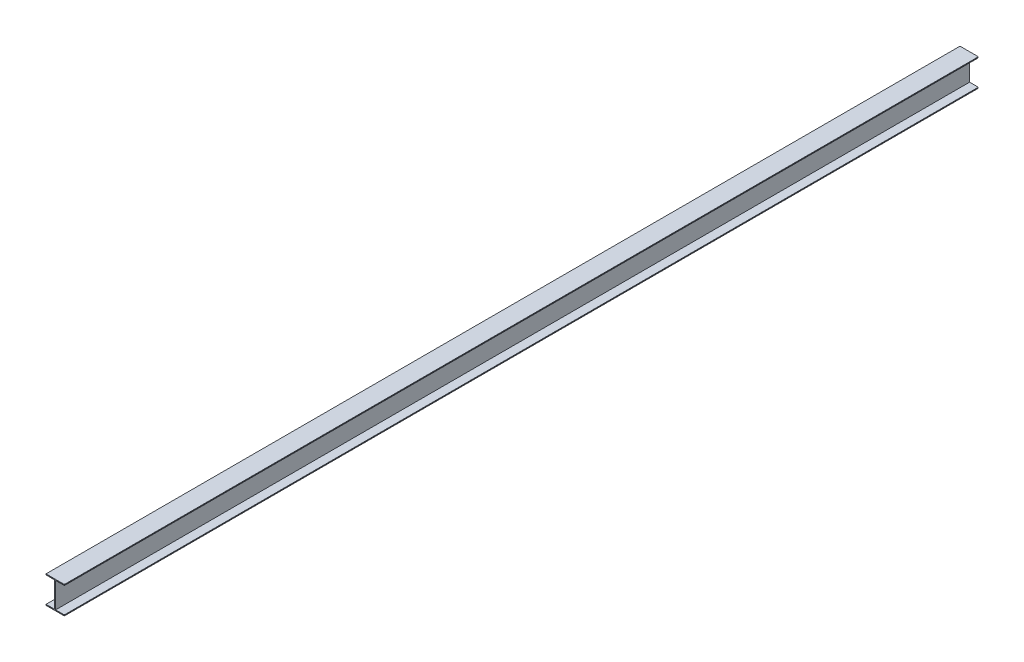
ISO-10303-21;
HEADER;
FILE_DESCRIPTION(('STEP AP214'),'2;1');
FILE_NAME('part.step','',(''),(''),'','','');
FILE_SCHEMA(('AUTOMOTIVE_DESIGN { 1 0 10303 214 1 1 1 1 }'));
ENDSEC;
DATA;
#1=APPLICATION_CONTEXT('core data for automotive mechanical design processes');
#2=APPLICATION_PROTOCOL_DEFINITION('international standard','automotive_design',2000,#1);
#3=PRODUCT_CONTEXT('',#1,'mechanical');
#4=PRODUCT('Part','Part','',(#3));
#5=PRODUCT_RELATED_PRODUCT_CATEGORY('part','',(#4));
#6=PRODUCT_DEFINITION_FORMATION('','',#4);
#7=PRODUCT_DEFINITION_CONTEXT('part definition',#1,'design');
#8=PRODUCT_DEFINITION('design','',#6,#7);
#9=PRODUCT_DEFINITION_SHAPE('','',#8);
#10=(LENGTH_UNIT() NAMED_UNIT(*) SI_UNIT(.MILLI.,.METRE.));
#11=(NAMED_UNIT(*) PLANE_ANGLE_UNIT() SI_UNIT($,.RADIAN.));
#12=(NAMED_UNIT(*) SI_UNIT($,.STERADIAN.) SOLID_ANGLE_UNIT());
#13=UNCERTAINTY_MEASURE_WITH_UNIT(LENGTH_MEASURE(1.E-05),#10,'distance_accuracy_value','');
#14=(GEOMETRIC_REPRESENTATION_CONTEXT(3) GLOBAL_UNCERTAINTY_ASSIGNED_CONTEXT((#13)) GLOBAL_UNIT_ASSIGNED_CONTEXT((#10,
#11,#12)) REPRESENTATION_CONTEXT('',''));
#15=CARTESIAN_POINT('',(0.,0.,0.));
#16=DIRECTION('',(0.,0.,1.));
#17=DIRECTION('',(1.,0.,0.));
#18=AXIS2_PLACEMENT_3D('',#15,#16,#17);
#19=CARTESIAN_POINT('',(101.6,-153.162240532958,5062.));
#20=DIRECTION('',(0.,1.,0.));
#21=DIRECTION('',(0.,0.,1.));
#22=AXIS2_PLACEMENT_3D('',#19,#20,#21);
#23=PLANE('',#22);
#24=DIRECTION('',(-1.,0.,0.));
#25=VECTOR('',#24,1.);
#26=CARTESIAN_POINT('',(101.6,-153.162240532958,2683.4));
#27=LINE('',#26,#25);
#28=CARTESIAN_POINT('',(98.425,-153.162240532958,2683.4));
#29=VERTEX_POINT('',#28);
#30=CARTESIAN_POINT('',(3.175,-153.162240532958,2683.4));
#31=VERTEX_POINT('',#30);
#32=EDGE_CURVE('E287',#29,#31,#27,.T.);
#33=ORIENTED_EDGE('',*,*,#32,.F.);
#34=DIRECTION('',(0.,0.,-1.));
#35=VECTOR('',#34,1.);
#36=CARTESIAN_POINT('',(98.425,-153.162240532958,5062.));
#37=LINE('',#36,#35);
#38=CARTESIAN_POINT('',(98.425,-153.162240532958,5058.825));
#39=VERTEX_POINT('',#38);
#40=EDGE_CURVE('E355',#29,#39,#37,.F.);
#41=ORIENTED_EDGE('',*,*,#40,.T.);
#42=DIRECTION('',(1.,0.,0.));
#43=VECTOR('',#42,1.);
#44=CARTESIAN_POINT('',(101.6,-153.162240532958,5058.825));
#45=LINE('',#44,#43);
#46=CARTESIAN_POINT('',(3.175,-153.162240532958,5058.825));
#47=VERTEX_POINT('',#46);
#48=EDGE_CURVE('E351',#39,#47,#45,.F.);
#49=ORIENTED_EDGE('',*,*,#48,.T.);
#50=DIRECTION('',(0.,0.,-1.));
#51=VECTOR('',#50,1.);
#52=CARTESIAN_POINT('',(3.175,-153.162240532958,5062.));
#53=LINE('',#52,#51);
#54=EDGE_CURVE('E353',#47,#31,#53,.T.);
#55=ORIENTED_EDGE('',*,*,#54,.T.);
#56=EDGE_LOOP('',(#33,#41,#49,#55));
#57=FACE_BOUND('',#56,.T.);
#58=ADVANCED_FACE('F38',(#57),#23,.F.);
#59=DIRECTION('',(1.,0.,0.));
#60=VECTOR('',#59,1.);
#61=CARTESIAN_POINT('',(101.6,-153.162240532958,2378.6));
#62=LINE('',#61,#60);
#63=CARTESIAN_POINT('',(3.175,-153.162240532958,2378.6));
#64=VERTEX_POINT('',#63);
#65=CARTESIAN_POINT('',(98.425,-153.162240532958,2378.6));
#66=VERTEX_POINT('',#65);
#67=EDGE_CURVE('E283',#64,#66,#62,.T.);
#68=ORIENTED_EDGE('',*,*,#67,.F.);
#69=DIRECTION('',(0.,0.,-1.));
#70=VECTOR('',#69,1.);
#71=CARTESIAN_POINT('',(3.175,-153.162240532958,5062.));
#72=LINE('',#71,#70);
#73=CARTESIAN_POINT('',(3.175,-153.162240532958,3.17499999999971));
#74=VERTEX_POINT('',#73);
#75=EDGE_CURVE('E323',#64,#74,#72,.T.);
#76=ORIENTED_EDGE('',*,*,#75,.T.);
#77=DIRECTION('',(1.,0.,0.));
#78=VECTOR('',#77,1.);
#79=CARTESIAN_POINT('',(98.425,-153.162240532958,3.17499999999971));
#80=LINE('',#79,#78);
#81=CARTESIAN_POINT('',(98.425,-153.162240532958,3.17499999999971));
#82=VERTEX_POINT('',#81);
#83=EDGE_CURVE('E321',#74,#82,#80,.T.);
#84=ORIENTED_EDGE('',*,*,#83,.T.);
#85=DIRECTION('',(0.,0.,-1.));
#86=VECTOR('',#85,1.);
#87=CARTESIAN_POINT('',(98.425,-153.162240532958,5062.));
#88=LINE('',#87,#86);
#89=EDGE_CURVE('E319',#82,#66,#88,.F.);
#90=ORIENTED_EDGE('',*,*,#89,.T.);
#91=EDGE_LOOP('',(#68,#76,#84,#90));
#92=FACE_BOUND('',#91,.T.);
#93=ADVANCED_FACE('F571',(#92),#23,.F.);
#94=CARTESIAN_POINT('',(0.,-7.11224053295814,5062.));
#95=DIRECTION('',(1.,0.,0.));
#96=DIRECTION('',(0.,0.,-1.));
#97=AXIS2_PLACEMENT_3D('',#94,#95,#96);
#98=PLANE('',#97);
#99=DIRECTION('',(0.,-1.,0.));
#100=VECTOR('',#99,1.);
#101=CARTESIAN_POINT('',(0.,-7.11224053295814,0.));
#102=LINE('',#101,#100);
#103=CARTESIAN_POINT('',(0.,-0.000240532958142959,0.));
#104=VERTEX_POINT('',#103);
#105=CARTESIAN_POINT('',(0.,-3.93724053295814,0.));
#106=VERTEX_POINT('',#105);
#107=EDGE_CURVE('E250',#104,#106,#102,.T.);
#108=ORIENTED_EDGE('',*,*,#107,.T.);
#109=DIRECTION('',(0.,0.,-1.));
#110=VECTOR('',#109,1.);
#111=CARTESIAN_POINT('',(0.,-3.93724053295814,5062.));
#112=LINE('',#111,#110);
#113=CARTESIAN_POINT('',(0.,-3.93724053295814,5062.));
#114=VERTEX_POINT('',#113);
#115=EDGE_CURVE('E417',#106,#114,#112,.F.);
#116=ORIENTED_EDGE('',*,*,#115,.T.);
#117=DIRECTION('',(0.,-1.,0.));
#118=VECTOR('',#117,1.);
#119=CARTESIAN_POINT('',(0.,-7.11224053295814,5062.));
#120=LINE('',#119,#118);
#121=CARTESIAN_POINT('',(0.,-0.000240532958142959,5062.));
#122=VERTEX_POINT('',#121);
#123=EDGE_CURVE('E224',#122,#114,#120,.T.);
#124=ORIENTED_EDGE('',*,*,#123,.F.);
#125=DIRECTION('',(0.,0.,-1.));
#126=VECTOR('',#125,1.);
#127=CARTESIAN_POINT('',(0.,-0.000240532958142959,5062.));
#128=LINE('',#127,#126);
#129=EDGE_CURVE('E249',#122,#104,#128,.T.);
#130=ORIENTED_EDGE('',*,*,#129,.T.);
#131=EDGE_LOOP('',(#108,#116,#124,#130));
#132=FACE_BOUND('',#131,.T.);
#133=ADVANCED_FACE('F459',(#132),#98,.F.);
#134=CARTESIAN_POINT('',(47.5660357142857,-7.11224053295814,5062.));
#135=DIRECTION('',(0.,1.,0.));
#136=DIRECTION('',(-1.,0.,0.));
#137=AXIS2_PLACEMENT_3D('',#134,#135,#136);
#138=PLANE('',#137);
#139=DIRECTION('',(0.,0.,-1.));
#140=VECTOR('',#139,1.);
#141=CARTESIAN_POINT('',(3.17499999999997,-7.11224053295814,5062.));
#142=LINE('',#141,#140);
#143=CARTESIAN_POINT('',(3.17499999999997,-7.11224053295814,5058.825));
#144=VERTEX_POINT('',#143);
#145=CARTESIAN_POINT('',(3.17499999999997,-7.11224053295814,3.17499999999971));
#146=VERTEX_POINT('',#145);
#147=EDGE_CURVE('E412',#144,#146,#142,.T.);
#148=ORIENTED_EDGE('',*,*,#147,.T.);
#149=DIRECTION('',(1.,0.,0.));
#150=VECTOR('',#149,1.);
#151=CARTESIAN_POINT('',(47.5660357142857,-7.11224053295814,3.17499999999971));
#152=LINE('',#151,#150);
#153=CARTESIAN_POINT('',(47.5660357142857,-7.11224053295814,3.17499999999971));
#154=VERTEX_POINT('',#153);
#155=EDGE_CURVE('E414',#146,#154,#152,.T.);
#156=ORIENTED_EDGE('',*,*,#155,.T.);
#157=DIRECTION('',(0.,0.,-1.));
#158=VECTOR('',#157,1.);
#159=CARTESIAN_POINT('',(47.5660357142857,-7.11224053295814,5062.));
#160=LINE('',#159,#158);
#161=CARTESIAN_POINT('',(47.5660357142857,-7.11224053295814,5058.825));
#162=VERTEX_POINT('',#161);
#163=EDGE_CURVE('E233',#162,#154,#160,.T.);
#164=ORIENTED_EDGE('',*,*,#163,.F.);
#165=DIRECTION('',(1.,0.,0.));
#166=VECTOR('',#165,1.);
#167=CARTESIAN_POINT('',(47.5660357142857,-7.11224053295814,5058.825));
#168=LINE('',#167,#166);
#169=EDGE_CURVE('E410',#162,#144,#168,.F.);
#170=ORIENTED_EDGE('',*,*,#169,.T.);
#171=EDGE_LOOP('',(#148,#156,#164,#170));
#172=FACE_BOUND('',#171,.T.);
#173=ADVANCED_FACE('F452',(#172),#138,.F.);
#174=CARTESIAN_POINT('',(47.5660357142857,-146.050240532958,5062.));
#175=DIRECTION('',(1.,0.,0.));
#176=DIRECTION('',(0.,0.,-1.));
#177=AXIS2_PLACEMENT_3D('',#174,#175,#176);
#178=PLANE('',#177);
#179=DIRECTION('',(0.,-1.,0.));
#180=VECTOR('',#179,1.);
#181=CARTESIAN_POINT('',(47.5660357142857,-146.050240532958,0.));
#182=LINE('',#181,#180);
#183=CARTESIAN_POINT('',(47.5660357142857,-3.93724053295814,0.));
#184=VERTEX_POINT('',#183);
#185=CARTESIAN_POINT('',(47.5660357142857,-146.050240532958,0.));
#186=VERTEX_POINT('',#185);
#187=EDGE_CURVE('E230',#184,#186,#182,.T.);
#188=ORIENTED_EDGE('',*,*,#187,.T.);
#189=DIRECTION('',(0.,0.,-1.));
#190=VECTOR('',#189,1.);
#191=CARTESIAN_POINT('',(47.5660357142857,-146.050240532958,5062.));
#192=LINE('',#191,#190);
#193=CARTESIAN_POINT('',(47.5660357142857,-146.050240532958,5062.));
#194=VERTEX_POINT('',#193);
#195=EDGE_CURVE('E227',#194,#186,#192,.T.);
#196=ORIENTED_EDGE('',*,*,#195,.F.);
#197=DIRECTION('',(0.,-1.,0.));
#198=VECTOR('',#197,1.);
#199=CARTESIAN_POINT('',(47.5660357142857,-146.050240532958,5062.));
#200=LINE('',#199,#198);
#201=CARTESIAN_POINT('',(47.5660357142857,-3.93724053295813,5062.));
#202=VERTEX_POINT('',#201);
#203=EDGE_CURVE('E62',#202,#194,#200,.T.);
#204=ORIENTED_EDGE('',*,*,#203,.F.);
#205=CARTESIAN_POINT('',(47.5660357142857,-3.93724053295814,5058.825));
#206=DIRECTION('',(1.,0.,0.));
#207=DIRECTION('',(0.,0.,-1.));
#208=AXIS2_PLACEMENT_3D('',#205,#206,#207);
#209=CIRCLE('',#208,3.175);
#210=EDGE_CURVE('E11',#202,#162,#209,.T.);
#211=ORIENTED_EDGE('',*,*,#210,.T.);
#212=ORIENTED_EDGE('',*,*,#163,.T.);
#213=CARTESIAN_POINT('',(47.5660357142857,-3.93724053295814,3.17499999999971));
#214=DIRECTION('',(1.,0.,0.));
#215=DIRECTION('',(0.,0.,-1.));
#216=AXIS2_PLACEMENT_3D('',#213,#214,#215);
#217=CIRCLE('',#216,3.175);
#218=EDGE_CURVE('E424',#154,#184,#217,.T.);
#219=ORIENTED_EDGE('',*,*,#218,.T.);
#220=EDGE_LOOP('',(#188,#196,#204,#211,#212,#219));
#221=FACE_BOUND('',#220,.T.);
#222=ADVANCED_FACE('F228',(#221),#178,.F.);
#223=CARTESIAN_POINT('',(0.,-146.050240532958,5062.));
#224=DIRECTION('',(0.,-1.,0.));
#225=DIRECTION('',(1.,0.,0.));
#226=AXIS2_PLACEMENT_3D('',#223,#224,#225);
#227=PLANE('',#226);
#228=DIRECTION('',(-1.,0.,0.));
#229=VECTOR('',#228,1.);
#230=CARTESIAN_POINT('',(0.,-146.050240532958,0.));
#231=LINE('',#230,#229);
#232=CARTESIAN_POINT('',(0.,-146.050240532958,0.));
#233=VERTEX_POINT('',#232);
#234=EDGE_CURVE('E255',#186,#233,#231,.T.);
#235=ORIENTED_EDGE('',*,*,#234,.T.);
#236=DIRECTION('',(0.,0.,-1.));
#237=VECTOR('',#236,1.);
#238=CARTESIAN_POINT('',(0.,-146.050240532958,5062.));
#239=LINE('',#238,#237);
#240=CARTESIAN_POINT('',(0.,-146.050240532958,5062.));
#241=VERTEX_POINT('',#240);
#242=EDGE_CURVE('E234',#241,#233,#239,.T.);
#243=ORIENTED_EDGE('',*,*,#242,.F.);
#244=DIRECTION('',(-1.,0.,0.));
#245=VECTOR('',#244,1.);
#246=CARTESIAN_POINT('',(0.,-146.050240532958,5062.));
#247=LINE('',#246,#245);
#248=EDGE_CURVE('E218',#194,#241,#247,.T.);
#249=ORIENTED_EDGE('',*,*,#248,.F.);
#250=ORIENTED_EDGE('',*,*,#195,.T.);
#251=EDGE_LOOP('',(#235,#243,#249,#250));
#252=FACE_BOUND('',#251,.T.);
#253=ADVANCED_FACE('F236',(#252),#227,.F.);
#254=CARTESIAN_POINT('',(0.,-153.162240532958,5062.));
#255=DIRECTION('',(1.,0.,0.));
#256=DIRECTION('',(0.,0.,-1.));
#257=AXIS2_PLACEMENT_3D('',#254,#255,#256);
#258=PLANE('',#257);
#259=DIRECTION('',(0.,-1.,0.));
#260=VECTOR('',#259,1.);
#261=CARTESIAN_POINT('',(0.,-153.162240532958,0.));
#262=LINE('',#261,#260);
#263=CARTESIAN_POINT('',(0.,-149.987240532958,0.));
#264=VERTEX_POINT('',#263);
#265=EDGE_CURVE('E257',#233,#264,#262,.T.);
#266=ORIENTED_EDGE('',*,*,#265,.T.);
#267=DIRECTION('',(0.,0.,-1.));
#268=VECTOR('',#267,1.);
#269=CARTESIAN_POINT('',(0.,-149.987240532958,5062.));
#270=LINE('',#269,#268);
#271=CARTESIAN_POINT('',(0.,-149.987240532958,2378.6));
#272=VERTEX_POINT('',#271);
#273=EDGE_CURVE('E330',#264,#272,#270,.F.);
#274=ORIENTED_EDGE('',*,*,#273,.T.);
#275=DIRECTION('',(0.,0.,-1.));
#276=VECTOR('',#275,1.);
#277=CARTESIAN_POINT('',(0.,-149.987240532958,5062.));
#278=LINE('',#277,#276);
#279=CARTESIAN_POINT('',(0.,-149.987240532958,2683.4));
#280=VERTEX_POINT('',#279);
#281=EDGE_CURVE('E328',#272,#280,#278,.F.);
#282=ORIENTED_EDGE('',*,*,#281,.T.);
#283=DIRECTION('',(0.,0.,-1.));
#284=VECTOR('',#283,1.);
#285=CARTESIAN_POINT('',(0.,-149.987240532958,5062.));
#286=LINE('',#285,#284);
#287=CARTESIAN_POINT('',(0.,-149.987240532958,5062.));
#288=VERTEX_POINT('',#287);
#289=EDGE_CURVE('E326',#280,#288,#286,.F.);
#290=ORIENTED_EDGE('',*,*,#289,.T.);
#291=DIRECTION('',(0.,-1.,0.));
#292=VECTOR('',#291,1.);
#293=CARTESIAN_POINT('',(0.,-153.162240532958,5062.));
#294=LINE('',#293,#292);
#295=EDGE_CURVE('E239',#241,#288,#294,.T.);
#296=ORIENTED_EDGE('',*,*,#295,.F.);
#297=ORIENTED_EDGE('',*,*,#242,.T.);
#298=EDGE_LOOP('',(#266,#274,#282,#290,#296,#297));
#299=FACE_BOUND('',#298,.T.);
#300=ADVANCED_FACE('F514',(#299),#258,.F.);
#301=ORIENTED_EDGE('',*,*,#32,.T.);
#302=DIRECTION('',(0.,0.,-1.));
#303=VECTOR('',#302,1.);
#304=CARTESIAN_POINT('',(3.175,-153.162240532958,5062.));
#305=LINE('',#304,#303);
#306=EDGE_CURVE('E337',#31,#64,#305,.T.);
#307=ORIENTED_EDGE('',*,*,#306,.T.);
#308=ORIENTED_EDGE('',*,*,#67,.T.);
#309=DIRECTION('',(0.,0.,-1.));
#310=VECTOR('',#309,1.);
#311=CARTESIAN_POINT('',(98.425,-153.162240532958,5062.));
#312=LINE('',#311,#310);
#313=CARTESIAN_POINT('',(98.425,-153.162240532958,2531.));
#314=VERTEX_POINT('',#313);
#315=EDGE_CURVE('E335',#66,#314,#312,.F.);
#316=ORIENTED_EDGE('',*,*,#315,.T.);
#317=DIRECTION('',(0.,0.,-1.));
#318=VECTOR('',#317,1.);
#319=CARTESIAN_POINT('',(98.425,-153.162240532958,5062.));
#320=LINE('',#319,#318);
#321=EDGE_CURVE('E333',#314,#29,#320,.F.);
#322=ORIENTED_EDGE('',*,*,#321,.T.);
#323=EDGE_LOOP('',(#301,#307,#308,#316,#322));
#324=FACE_BOUND('',#323,.T.);
#325=ADVANCED_FACE('F532',(#324),#23,.F.);
#326=CARTESIAN_POINT('',(101.6,-146.050240532958,5062.));
#327=DIRECTION('',(-1.,0.,0.));
#328=DIRECTION('',(0.,0.,1.));
#329=AXIS2_PLACEMENT_3D('',#326,#327,#328);
#330=PLANE('',#329);
#331=DIRECTION('',(0.,0.,-1.));
#332=VECTOR('',#331,1.);
#333=CARTESIAN_POINT('',(101.6,-149.987240532958,5062.));
#334=LINE('',#333,#332);
#335=CARTESIAN_POINT('',(101.6,-149.987240532958,2531.));
#336=VERTEX_POINT('',#335);
#337=CARTESIAN_POINT('',(101.6,-149.987240532958,2378.6));
#338=VERTEX_POINT('',#337);
#339=EDGE_CURVE('E347',#336,#338,#334,.T.);
#340=ORIENTED_EDGE('',*,*,#339,.T.);
#341=DIRECTION('',(0.,0.,-1.));
#342=VECTOR('',#341,1.);
#343=CARTESIAN_POINT('',(101.6,-149.987240532958,5062.));
#344=LINE('',#343,#342);
#345=CARTESIAN_POINT('',(101.6,-149.987240532958,3.17499999999971));
#346=VERTEX_POINT('',#345);
#347=EDGE_CURVE('E349',#338,#346,#344,.T.);
#348=ORIENTED_EDGE('',*,*,#347,.T.);
#349=DIRECTION('',(0.,1.,0.));
#350=VECTOR('',#349,1.);
#351=CARTESIAN_POINT('',(101.6,-146.050240532958,3.17499999999971));
#352=LINE('',#351,#350);
#353=CARTESIAN_POINT('',(101.6,-146.050240532958,3.17499999999971));
#354=VERTEX_POINT('',#353);
#355=EDGE_CURVE('E308',#346,#354,#352,.T.);
#356=ORIENTED_EDGE('',*,*,#355,.T.);
#357=DIRECTION('',(0.,0.,-1.));
#358=VECTOR('',#357,1.);
#359=CARTESIAN_POINT('',(101.6,-146.050240532958,5062.));
#360=LINE('',#359,#358);
#361=CARTESIAN_POINT('',(101.6,-146.050240532958,5058.825));
#362=VERTEX_POINT('',#361);
#363=EDGE_CURVE('E277',#362,#354,#360,.T.);
#364=ORIENTED_EDGE('',*,*,#363,.F.);
#365=DIRECTION('',(0.,1.,0.));
#366=VECTOR('',#365,1.);
#367=CARTESIAN_POINT('',(101.6,-146.050240532958,5058.825));
#368=LINE('',#367,#366);
#369=CARTESIAN_POINT('',(101.6,-149.987240532958,5058.825));
#370=VERTEX_POINT('',#369);
#371=EDGE_CURVE('E310',#362,#370,#368,.F.);
#372=ORIENTED_EDGE('',*,*,#371,.T.);
#373=DIRECTION('',(0.,0.,-1.));
#374=VECTOR('',#373,1.);
#375=CARTESIAN_POINT('',(101.6,-149.987240532958,5062.));
#376=LINE('',#375,#374);
#377=CARTESIAN_POINT('',(101.6,-149.987240532958,2683.4));
#378=VERTEX_POINT('',#377);
#379=EDGE_CURVE('E343',#370,#378,#376,.T.);
#380=ORIENTED_EDGE('',*,*,#379,.T.);
#381=DIRECTION('',(0.,0.,-1.));
#382=VECTOR('',#381,1.);
#383=CARTESIAN_POINT('',(101.6,-149.987240532958,5062.));
#384=LINE('',#383,#382);
#385=EDGE_CURVE('E345',#378,#336,#384,.T.);
#386=ORIENTED_EDGE('',*,*,#385,.T.);
#387=EDGE_LOOP('',(#340,#348,#356,#364,#372,#380,#386));
#388=FACE_BOUND('',#387,.T.);
#389=ADVANCED_FACE('F547',(#388),#330,.F.);
#390=CARTESIAN_POINT('',(53.4080357142857,-146.050240532958,5062.));
#391=DIRECTION('',(0.,-1.,0.));
#392=DIRECTION('',(1.,0.,0.));
#393=AXIS2_PLACEMENT_3D('',#390,#391,#392);
#394=PLANE('',#393);
#395=DIRECTION('',(-1.,0.,0.));
#396=VECTOR('',#395,1.);
#397=CARTESIAN_POINT('',(53.4080357142857,-146.050240532958,5062.));
#398=LINE('',#397,#396);
#399=CARTESIAN_POINT('',(98.425,-146.050240532958,5062.));
#400=VERTEX_POINT('',#399);
#401=CARTESIAN_POINT('',(53.4080357142857,-146.050240532958,5062.));
#402=VERTEX_POINT('',#401);
#403=EDGE_CURVE('E241',#400,#402,#398,.T.);
#404=ORIENTED_EDGE('',*,*,#403,.F.);
#405=CARTESIAN_POINT('',(98.425,-146.050240532958,5058.825));
#406=DIRECTION('',(0.,-1.,0.));
#407=DIRECTION('',(1.,0.,0.));
#408=AXIS2_PLACEMENT_3D('',#405,#406,#407);
#409=CIRCLE('',#408,3.175);
#410=EDGE_CURVE('E306',#400,#362,#409,.F.);
#411=ORIENTED_EDGE('',*,*,#410,.T.);
#412=ORIENTED_EDGE('',*,*,#363,.T.);
#413=CARTESIAN_POINT('',(98.425,-146.050240532958,3.17499999999971));
#414=DIRECTION('',(0.,-1.,0.));
#415=DIRECTION('',(1.,0.,0.));
#416=AXIS2_PLACEMENT_3D('',#413,#414,#415);
#417=CIRCLE('',#416,3.175);
#418=CARTESIAN_POINT('',(98.425,-146.050240532958,0.));
#419=VERTEX_POINT('',#418);
#420=EDGE_CURVE('E304',#354,#419,#417,.F.);
#421=ORIENTED_EDGE('',*,*,#420,.T.);
#422=DIRECTION('',(-1.,0.,0.));
#423=VECTOR('',#422,1.);
#424=CARTESIAN_POINT('',(53.4080357142857,-146.050240532958,0.));
#425=LINE('',#424,#423);
#426=CARTESIAN_POINT('',(53.4080357142857,-146.050240532958,0.));
#427=VERTEX_POINT('',#426);
#428=EDGE_CURVE('E260',#419,#427,#425,.T.);
#429=ORIENTED_EDGE('',*,*,#428,.T.);
#430=DIRECTION('',(0.,0.,-1.));
#431=VECTOR('',#430,1.);
#432=CARTESIAN_POINT('',(53.4080357142857,-146.050240532958,5062.));
#433=LINE('',#432,#431);
#434=EDGE_CURVE('E274',#402,#427,#433,.T.);
#435=ORIENTED_EDGE('',*,*,#434,.F.);
#436=EDGE_LOOP('',(#404,#411,#412,#421,#429,#435));
#437=FACE_BOUND('',#436,.T.);
#438=ADVANCED_FACE('F490',(#437),#394,.F.);
#439=CARTESIAN_POINT('',(53.4080357142857,-7.11224053295815,5062.));
#440=DIRECTION('',(-1.,0.,0.));
#441=DIRECTION('',(0.,-1.,0.));
#442=AXIS2_PLACEMENT_3D('',#439,#440,#441);
#443=PLANE('',#442);
#444=DIRECTION('',(0.,1.,0.));
#445=VECTOR('',#444,1.);
#446=CARTESIAN_POINT('',(53.4080357142857,-7.11224053295815,0.));
#447=LINE('',#446,#445);
#448=CARTESIAN_POINT('',(53.4080357142857,-3.93724053295815,0.));
#449=VERTEX_POINT('',#448);
#450=EDGE_CURVE('E262',#427,#449,#447,.T.);
#451=ORIENTED_EDGE('',*,*,#450,.T.);
#452=CARTESIAN_POINT('',(53.4080357142857,-3.93724053295815,3.17499999999971));
#453=DIRECTION('',(-1.,0.,0.));
#454=DIRECTION('',(0.,-1.,0.));
#455=AXIS2_PLACEMENT_3D('',#452,#453,#454);
#456=CIRCLE('',#455,3.175);
#457=CARTESIAN_POINT('',(53.4080357142857,-7.11224053295815,3.17499999999971));
#458=VERTEX_POINT('',#457);
#459=EDGE_CURVE('E422',#449,#458,#456,.T.);
#460=ORIENTED_EDGE('',*,*,#459,.T.);
#461=DIRECTION('',(0.,0.,-1.));
#462=VECTOR('',#461,1.);
#463=CARTESIAN_POINT('',(53.4080357142857,-7.11224053295815,5062.));
#464=LINE('',#463,#462);
#465=CARTESIAN_POINT('',(53.4080357142857,-7.11224053295815,5058.825));
#466=VERTEX_POINT('',#465);
#467=EDGE_CURVE('E271',#466,#458,#464,.T.);
#468=ORIENTED_EDGE('',*,*,#467,.F.);
#469=CARTESIAN_POINT('',(53.4080357142857,-3.93724053295815,5058.825));
#470=DIRECTION('',(-1.,0.,0.));
#471=DIRECTION('',(0.,-1.,0.));
#472=AXIS2_PLACEMENT_3D('',#469,#470,#471);
#473=CIRCLE('',#472,3.175);
#474=CARTESIAN_POINT('',(53.4080357142857,-3.93724053295815,5062.));
#475=VERTEX_POINT('',#474);
#476=EDGE_CURVE('E47',#466,#475,#473,.T.);
#477=ORIENTED_EDGE('',*,*,#476,.T.);
#478=DIRECTION('',(0.,1.,0.));
#479=VECTOR('',#478,1.);
#480=CARTESIAN_POINT('',(53.4080357142857,-7.11224053295815,5062.));
#481=LINE('',#480,#479);
#482=EDGE_CURVE('E55',#402,#475,#481,.T.);
#483=ORIENTED_EDGE('',*,*,#482,.F.);
#484=ORIENTED_EDGE('',*,*,#434,.T.);
#485=EDGE_LOOP('',(#451,#460,#468,#477,#483,#484));
#486=FACE_BOUND('',#485,.T.);
#487=ADVANCED_FACE('F485',(#486),#443,.F.);
#488=CARTESIAN_POINT('',(101.6,-7.11224053295814,5062.));
#489=DIRECTION('',(0.,1.,0.));
#490=DIRECTION('',(-1.,0.,0.));
#491=AXIS2_PLACEMENT_3D('',#488,#489,#490);
#492=PLANE('',#491);
#493=ORIENTED_EDGE('',*,*,#467,.T.);
#494=DIRECTION('',(1.,0.,0.));
#495=VECTOR('',#494,1.);
#496=CARTESIAN_POINT('',(98.425,-7.11224053295814,3.17499999999971));
#497=LINE('',#496,#495);
#498=CARTESIAN_POINT('',(98.425,-7.11224053295814,3.17499999999971));
#499=VERTEX_POINT('',#498);
#500=EDGE_CURVE('E396',#458,#499,#497,.T.);
#501=ORIENTED_EDGE('',*,*,#500,.T.);
#502=DIRECTION('',(0.,0.,-1.));
#503=VECTOR('',#502,1.);
#504=CARTESIAN_POINT('',(98.425,-7.11224053295814,5062.));
#505=LINE('',#504,#503);
#506=CARTESIAN_POINT('',(98.425,-7.11224053295814,5058.825));
#507=VERTEX_POINT('',#506);
#508=EDGE_CURVE('E394',#499,#507,#505,.F.);
#509=ORIENTED_EDGE('',*,*,#508,.T.);
#510=DIRECTION('',(1.,0.,0.));
#511=VECTOR('',#510,1.);
#512=CARTESIAN_POINT('',(101.6,-7.11224053295814,5058.825));
#513=LINE('',#512,#511);
#514=EDGE_CURVE('E361',#507,#466,#513,.F.);
#515=ORIENTED_EDGE('',*,*,#514,.T.);
#516=EDGE_LOOP('',(#493,#501,#509,#515));
#517=FACE_BOUND('',#516,.T.);
#518=ADVANCED_FACE('F616',(#517),#492,.F.);
#519=CARTESIAN_POINT('',(101.6,-0.000240532958130516,5062.));
#520=DIRECTION('',(-1.,0.,0.));
#521=DIRECTION('',(0.,0.,1.));
#522=AXIS2_PLACEMENT_3D('',#519,#520,#521);
#523=PLANE('',#522);
#524=DIRECTION('',(0.,1.,0.));
#525=VECTOR('',#524,1.);
#526=CARTESIAN_POINT('',(101.6,-0.000240532958130516,5058.825));
#527=LINE('',#526,#525);
#528=CARTESIAN_POINT('',(101.6,-0.000240532958130516,5058.825));
#529=VERTEX_POINT('',#528);
#530=CARTESIAN_POINT('',(101.6,-3.93724053295814,5058.825));
#531=VERTEX_POINT('',#530);
#532=EDGE_CURVE('E301',#529,#531,#527,.F.);
#533=ORIENTED_EDGE('',*,*,#532,.T.);
#534=DIRECTION('',(0.,0.,-1.));
#535=VECTOR('',#534,1.);
#536=CARTESIAN_POINT('',(101.6,-3.93724053295814,5062.));
#537=LINE('',#536,#535);
#538=CARTESIAN_POINT('',(101.6,-3.93724053295814,3.17499999999971));
#539=VERTEX_POINT('',#538);
#540=EDGE_CURVE('E406',#531,#539,#537,.T.);
#541=ORIENTED_EDGE('',*,*,#540,.T.);
#542=DIRECTION('',(0.,1.,0.));
#543=VECTOR('',#542,1.);
#544=CARTESIAN_POINT('',(101.6,-0.000240532958130516,3.17499999999971));
#545=LINE('',#544,#543);
#546=CARTESIAN_POINT('',(101.6,-0.000240532958130516,3.17499999999971));
#547=VERTEX_POINT('',#546);
#548=EDGE_CURVE('E299',#539,#547,#545,.T.);
#549=ORIENTED_EDGE('',*,*,#548,.T.);
#550=DIRECTION('',(0.,0.,-1.));
#551=VECTOR('',#550,1.);
#552=CARTESIAN_POINT('',(101.6,-0.000240532958130516,5062.));
#553=LINE('',#552,#551);
#554=EDGE_CURVE('E268',#529,#547,#553,.T.);
#555=ORIENTED_EDGE('',*,*,#554,.F.);
#556=EDGE_LOOP('',(#533,#541,#549,#555));
#557=FACE_BOUND('',#556,.T.);
#558=ADVANCED_FACE('F624',(#557),#523,.F.);
#559=CARTESIAN_POINT('',(0.,-0.000240532958142959,5062.));
#560=DIRECTION('',(0.,-1.,0.));
#561=DIRECTION('',(1.,0.,0.));
#562=AXIS2_PLACEMENT_3D('',#559,#560,#561);
#563=PLANE('',#562);
#564=DIRECTION('',(-1.,0.,0.));
#565=VECTOR('',#564,1.);
#566=CARTESIAN_POINT('',(0.,-0.000240532958142959,5062.));
#567=LINE('',#566,#565);
#568=CARTESIAN_POINT('',(98.425,-0.000240532958130905,5062.));
#569=VERTEX_POINT('',#568);
#570=EDGE_CURVE('E247',#569,#122,#567,.T.);
#571=ORIENTED_EDGE('',*,*,#570,.F.);
#572=CARTESIAN_POINT('',(98.425,-0.000240532958130905,5058.825));
#573=DIRECTION('',(0.,-1.,0.));
#574=DIRECTION('',(1.,0.,0.));
#575=AXIS2_PLACEMENT_3D('',#572,#573,#574);
#576=CIRCLE('',#575,3.175);
#577=EDGE_CURVE('E297',#569,#529,#576,.F.);
#578=ORIENTED_EDGE('',*,*,#577,.T.);
#579=ORIENTED_EDGE('',*,*,#554,.T.);
#580=CARTESIAN_POINT('',(98.425,-0.000240532958130905,3.17499999999971));
#581=DIRECTION('',(0.,-1.,0.));
#582=DIRECTION('',(1.,0.,0.));
#583=AXIS2_PLACEMENT_3D('',#580,#581,#582);
#584=CIRCLE('',#583,3.175);
#585=CARTESIAN_POINT('',(98.425,-0.000240532958130905,0.));
#586=VERTEX_POINT('',#585);
#587=EDGE_CURVE('E295',#547,#586,#584,.F.);
#588=ORIENTED_EDGE('',*,*,#587,.T.);
#589=DIRECTION('',(-1.,0.,0.));
#590=VECTOR('',#589,1.);
#591=CARTESIAN_POINT('',(0.,-0.000240532958142959,0.));
#592=LINE('',#591,#590);
#593=EDGE_CURVE('E264',#586,#104,#592,.T.);
#594=ORIENTED_EDGE('',*,*,#593,.T.);
#595=ORIENTED_EDGE('',*,*,#129,.F.);
#596=EDGE_LOOP('',(#571,#578,#579,#588,#594,#595));
#597=FACE_BOUND('',#596,.T.);
#598=ADVANCED_FACE('F464',(#597),#563,.F.);
#599=CARTESIAN_POINT('',(0.,0.,5062.));
#600=DIRECTION('',(0.,0.,-1.));
#601=DIRECTION('',(-1.,0.,0.));
#602=AXIS2_PLACEMENT_3D('',#599,#600,#601);
#603=PLANE('',#602);
#604=ORIENTED_EDGE('',*,*,#482,.T.);
#605=DIRECTION('',(1.,0.,0.));
#606=VECTOR('',#605,1.);
#607=CARTESIAN_POINT('',(0.,-3.93724053295816,5062.));
#608=LINE('',#607,#606);
#609=CARTESIAN_POINT('',(98.425,-3.93724053295814,5062.));
#610=VERTEX_POINT('',#609);
#611=EDGE_CURVE('E420',#475,#610,#608,.T.);
#612=ORIENTED_EDGE('',*,*,#611,.T.);
#613=DIRECTION('',(0.,1.,0.));
#614=VECTOR('',#613,1.);
#615=CARTESIAN_POINT('',(98.425,0.,5062.));
#616=LINE('',#615,#614);
#617=EDGE_CURVE('E293',#610,#569,#616,.T.);
#618=ORIENTED_EDGE('',*,*,#617,.T.);
#619=ORIENTED_EDGE('',*,*,#570,.T.);
#620=ORIENTED_EDGE('',*,*,#123,.T.);
#621=DIRECTION('',(1.,0.,0.));
#622=VECTOR('',#621,1.);
#623=CARTESIAN_POINT('',(0.,-3.93724053295814,5062.));
#624=LINE('',#623,#622);
#625=EDGE_CURVE('E222',#114,#202,#624,.T.);
#626=ORIENTED_EDGE('',*,*,#625,.T.);
#627=ORIENTED_EDGE('',*,*,#203,.T.);
#628=ORIENTED_EDGE('',*,*,#248,.T.);
#629=ORIENTED_EDGE('',*,*,#295,.T.);
#630=DIRECTION('',(1.,0.,0.));
#631=VECTOR('',#630,1.);
#632=CARTESIAN_POINT('',(0.,-149.987240532958,5062.));
#633=LINE('',#632,#631);
#634=CARTESIAN_POINT('',(98.425,-149.987240532958,5062.));
#635=VERTEX_POINT('',#634);
#636=EDGE_CURVE('E359',#288,#635,#633,.T.);
#637=ORIENTED_EDGE('',*,*,#636,.T.);
#638=DIRECTION('',(0.,1.,0.));
#639=VECTOR('',#638,1.);
#640=CARTESIAN_POINT('',(98.425,0.,5062.));
#641=LINE('',#640,#639);
#642=EDGE_CURVE('E291',#635,#400,#641,.T.);
#643=ORIENTED_EDGE('',*,*,#642,.T.);
#644=ORIENTED_EDGE('',*,*,#403,.T.);
#645=EDGE_LOOP('',(#604,#612,#618,#619,#620,#626,#627,#628,#629,#637,#643,#644));
#646=FACE_BOUND('',#645,.T.);
#647=ADVANCED_FACE('F215',(#646),#603,.F.);
#648=CARTESIAN_POINT('',(0.,0.,0.));
#649=DIRECTION('',(0.,0.,-1.));
#650=DIRECTION('',(-1.,0.,0.));
#651=AXIS2_PLACEMENT_3D('',#648,#649,#650);
#652=PLANE('',#651);
#653=DIRECTION('',(0.,1.,0.));
#654=VECTOR('',#653,1.);
#655=CARTESIAN_POINT('',(98.425,-7.11224053295814,0.));
#656=LINE('',#655,#654);
#657=CARTESIAN_POINT('',(98.425,-3.93724053295814,0.));
#658=VERTEX_POINT('',#657);
#659=EDGE_CURVE('E313',#586,#658,#656,.F.);
#660=ORIENTED_EDGE('',*,*,#659,.T.);
#661=DIRECTION('',(1.,0.,0.));
#662=VECTOR('',#661,1.);
#663=CARTESIAN_POINT('',(53.4080357142857,-3.93724053295815,0.));
#664=LINE('',#663,#662);
#665=EDGE_CURVE('E401',#658,#449,#664,.F.);
#666=ORIENTED_EDGE('',*,*,#665,.T.);
#667=ORIENTED_EDGE('',*,*,#450,.F.);
#668=ORIENTED_EDGE('',*,*,#428,.F.);
#669=DIRECTION('',(0.,1.,0.));
#670=VECTOR('',#669,1.);
#671=CARTESIAN_POINT('',(98.425,-153.162240532958,0.));
#672=LINE('',#671,#670);
#673=CARTESIAN_POINT('',(98.425,-149.987240532958,0.));
#674=VERTEX_POINT('',#673);
#675=EDGE_CURVE('E316',#419,#674,#672,.F.);
#676=ORIENTED_EDGE('',*,*,#675,.T.);
#677=DIRECTION('',(1.,0.,0.));
#678=VECTOR('',#677,1.);
#679=CARTESIAN_POINT('',(0.,-149.987240532958,0.));
#680=LINE('',#679,#678);
#681=EDGE_CURVE('E339',#674,#264,#680,.F.);
#682=ORIENTED_EDGE('',*,*,#681,.T.);
#683=ORIENTED_EDGE('',*,*,#265,.F.);
#684=ORIENTED_EDGE('',*,*,#234,.F.);
#685=ORIENTED_EDGE('',*,*,#187,.F.);
#686=DIRECTION('',(1.,0.,0.));
#687=VECTOR('',#686,1.);
#688=CARTESIAN_POINT('',(0.,-3.93724053295814,0.));
#689=LINE('',#688,#687);
#690=EDGE_CURVE('E399',#184,#106,#689,.F.);
#691=ORIENTED_EDGE('',*,*,#690,.T.);
#692=ORIENTED_EDGE('',*,*,#107,.F.);
#693=ORIENTED_EDGE('',*,*,#593,.F.);
#694=EDGE_LOOP('',(#660,#666,#667,#668,#676,#682,#683,#684,#685,#691,#692,#693));
#695=FACE_BOUND('',#694,.T.);
#696=ADVANCED_FACE('F456',(#695),#652,.T.);
#697=CARTESIAN_POINT('',(98.425,0.,5058.825));
#698=DIRECTION('',(0.,1.,0.));
#699=DIRECTION('',(0.,0.,1.));
#700=AXIS2_PLACEMENT_3D('',#697,#698,#699);
#701=CYLINDRICAL_SURFACE('',#700,3.175);
#702=ORIENTED_EDGE('',*,*,#617,.F.);
#703=CARTESIAN_POINT('',(98.425,-3.93724053295814,5058.825));
#704=DIRECTION('',(0.,1.,0.));
#705=DIRECTION('',(0.,0.,1.));
#706=AXIS2_PLACEMENT_3D('',#703,#704,#705);
#707=CIRCLE('',#706,3.175);
#708=EDGE_CURVE('E408',#610,#531,#707,.T.);
#709=ORIENTED_EDGE('',*,*,#708,.T.);
#710=ORIENTED_EDGE('',*,*,#532,.F.);
#711=ORIENTED_EDGE('',*,*,#577,.F.);
#712=EDGE_LOOP('',(#702,#709,#710,#711));
#713=FACE_BOUND('',#712,.T.);
#714=ADVANCED_FACE('F560',(#713),#701,.T.);
#715=CARTESIAN_POINT('',(98.425,0.,5058.825));
#716=DIRECTION('',(0.,1.,0.));
#717=DIRECTION('',(0.,0.,1.));
#718=AXIS2_PLACEMENT_3D('',#715,#716,#717);
#719=CYLINDRICAL_SURFACE('',#718,3.175);
#720=ORIENTED_EDGE('',*,*,#642,.F.);
#721=CARTESIAN_POINT('',(98.425,-149.987240532958,5058.825));
#722=DIRECTION('',(0.,1.,0.));
#723=DIRECTION('',(0.,0.,1.));
#724=AXIS2_PLACEMENT_3D('',#721,#722,#723);
#725=CIRCLE('',#724,3.175);
#726=EDGE_CURVE('E357',#635,#370,#725,.T.);
#727=ORIENTED_EDGE('',*,*,#726,.T.);
#728=ORIENTED_EDGE('',*,*,#371,.F.);
#729=ORIENTED_EDGE('',*,*,#410,.F.);
#730=EDGE_LOOP('',(#720,#727,#728,#729));
#731=FACE_BOUND('',#730,.T.);
#732=ADVANCED_FACE('F557',(#731),#719,.T.);
#733=CARTESIAN_POINT('',(98.425,-146.050240532958,3.17499999999971));
#734=DIRECTION('',(0.,-1.,0.));
#735=DIRECTION('',(0.,0.,-1.));
#736=AXIS2_PLACEMENT_3D('',#733,#734,#735);
#737=CYLINDRICAL_SURFACE('',#736,3.175);
#738=ORIENTED_EDGE('',*,*,#355,.F.);
#739=CARTESIAN_POINT('',(98.425,-149.987240532958,3.17499999999971));
#740=DIRECTION('',(0.,-1.,0.));
#741=DIRECTION('',(0.,0.,-1.));
#742=AXIS2_PLACEMENT_3D('',#739,#740,#741);
#743=CIRCLE('',#742,3.175);
#744=EDGE_CURVE('E341',#346,#674,#743,.F.);
#745=ORIENTED_EDGE('',*,*,#744,.T.);
#746=ORIENTED_EDGE('',*,*,#675,.F.);
#747=ORIENTED_EDGE('',*,*,#420,.F.);
#748=EDGE_LOOP('',(#738,#745,#746,#747));
#749=FACE_BOUND('',#748,.T.);
#750=ADVANCED_FACE('F495',(#749),#737,.T.);
#751=CARTESIAN_POINT('',(98.425,-0.000240532958130516,3.17499999999971));
#752=DIRECTION('',(0.,-1.,0.));
#753=DIRECTION('',(0.,0.,-1.));
#754=AXIS2_PLACEMENT_3D('',#751,#752,#753);
#755=CYLINDRICAL_SURFACE('',#754,3.175);
#756=ORIENTED_EDGE('',*,*,#548,.F.);
#757=CARTESIAN_POINT('',(98.425,-3.93724053295814,3.17499999999971));
#758=DIRECTION('',(0.,-1.,0.));
#759=DIRECTION('',(0.,0.,-1.));
#760=AXIS2_PLACEMENT_3D('',#757,#758,#759);
#761=CIRCLE('',#760,3.175);
#762=EDGE_CURVE('E404',#539,#658,#761,.F.);
#763=ORIENTED_EDGE('',*,*,#762,.T.);
#764=ORIENTED_EDGE('',*,*,#659,.F.);
#765=ORIENTED_EDGE('',*,*,#587,.F.);
#766=EDGE_LOOP('',(#756,#763,#764,#765));
#767=FACE_BOUND('',#766,.T.);
#768=ADVANCED_FACE('F470',(#767),#755,.T.);
#769=CARTESIAN_POINT('',(98.425,-149.987240532958,5062.));
#770=DIRECTION('',(0.,0.,-1.));
#771=DIRECTION('',(-1.,0.,0.));
#772=AXIS2_PLACEMENT_3D('',#769,#770,#771);
#773=CYLINDRICAL_SURFACE('',#772,3.175);
#774=CARTESIAN_POINT('',(98.425,-149.987240532958,5058.825));
#775=DIRECTION('',(0.,0.,1.));
#776=DIRECTION('',(1.,0.,0.));
#777=AXIS2_PLACEMENT_3D('',#774,#775,#776);
#778=CIRCLE('',#777,3.175);
#779=EDGE_CURVE('E388',#39,#370,#778,.T.);
#780=ORIENTED_EDGE('',*,*,#779,.F.);
#781=ORIENTED_EDGE('',*,*,#40,.F.);
#782=CARTESIAN_POINT('',(98.425,-149.987240532958,2683.4));
#783=DIRECTION('',(0.,0.,-1.));
#784=DIRECTION('',(-1.,0.,0.));
#785=AXIS2_PLACEMENT_3D('',#782,#783,#784);
#786=CIRCLE('',#785,3.175);
#787=EDGE_CURVE('E253',#378,#29,#786,.T.);
#788=ORIENTED_EDGE('',*,*,#787,.F.);
#789=ORIENTED_EDGE('',*,*,#379,.F.);
#790=EDGE_LOOP('',(#780,#781,#788,#789));
#791=FACE_BOUND('',#790,.T.);
#792=ADVANCED_FACE('F552',(#791),#773,.T.);
#793=CARTESIAN_POINT('',(98.425,-149.987240532958,5062.));
#794=DIRECTION('',(0.,0.,-1.));
#795=DIRECTION('',(-1.,0.,0.));
#796=AXIS2_PLACEMENT_3D('',#793,#794,#795);
#797=CYLINDRICAL_SURFACE('',#796,3.175);
#798=ORIENTED_EDGE('',*,*,#787,.T.);
#799=ORIENTED_EDGE('',*,*,#321,.F.);
#800=CARTESIAN_POINT('',(98.425,-149.987240532958,2531.));
#801=DIRECTION('',(0.,0.,-1.));
#802=DIRECTION('',(-1.,0.,0.));
#803=AXIS2_PLACEMENT_3D('',#800,#801,#802);
#804=CIRCLE('',#803,3.175);
#805=EDGE_CURVE('E385',#336,#314,#804,.T.);
#806=ORIENTED_EDGE('',*,*,#805,.F.);
#807=ORIENTED_EDGE('',*,*,#385,.F.);
#808=EDGE_LOOP('',(#798,#799,#806,#807));
#809=FACE_BOUND('',#808,.T.);
#810=ADVANCED_FACE('F538',(#809),#797,.T.);
#811=CARTESIAN_POINT('',(98.425,-149.987240532958,5058.825));
#812=DIRECTION('',(0.,1.,0.));
#813=DIRECTION('',(0.,0.,1.));
#814=AXIS2_PLACEMENT_3D('',#811,#812,#813);
#815=SPHERICAL_SURFACE('',#814,3.175);
#816=ORIENTED_EDGE('',*,*,#779,.T.);
#817=ORIENTED_EDGE('',*,*,#726,.F.);
#818=CARTESIAN_POINT('',(98.425,-149.987240532958,5058.825));
#819=DIRECTION('',(-1.,0.,0.));
#820=DIRECTION('',(0.,0.,1.));
#821=AXIS2_PLACEMENT_3D('',#818,#819,#820);
#822=CIRCLE('',#821,3.175);
#823=EDGE_CURVE('E382',#39,#635,#822,.T.);
#824=ORIENTED_EDGE('',*,*,#823,.F.);
#825=EDGE_LOOP('',(#816,#817,#824));
#826=FACE_BOUND('',#825,.T.);
#827=ADVANCED_FACE('F555',(#826),#815,.T.);
#828=CARTESIAN_POINT('',(98.425,-149.987240532958,5062.));
#829=DIRECTION('',(0.,0.,-1.));
#830=DIRECTION('',(-1.,0.,0.));
#831=AXIS2_PLACEMENT_3D('',#828,#829,#830);
#832=CYLINDRICAL_SURFACE('',#831,3.175);
#833=ORIENTED_EDGE('',*,*,#805,.T.);
#834=ORIENTED_EDGE('',*,*,#315,.F.);
#835=CARTESIAN_POINT('',(98.425,-149.987240532958,2378.6));
#836=DIRECTION('',(0.,0.,-1.));
#837=DIRECTION('',(-1.,0.,0.));
#838=AXIS2_PLACEMENT_3D('',#835,#836,#837);
#839=CIRCLE('',#838,3.175);
#840=EDGE_CURVE('E379',#338,#66,#839,.T.);
#841=ORIENTED_EDGE('',*,*,#840,.F.);
#842=ORIENTED_EDGE('',*,*,#339,.F.);
#843=EDGE_LOOP('',(#833,#834,#841,#842));
#844=FACE_BOUND('',#843,.T.);
#845=ADVANCED_FACE('F543',(#844),#832,.T.);
#846=CARTESIAN_POINT('',(0.,-149.987240532958,5058.825));
#847=DIRECTION('',(1.,0.,0.));
#848=DIRECTION('',(0.,0.,-1.));
#849=AXIS2_PLACEMENT_3D('',#846,#847,#848);
#850=CYLINDRICAL_SURFACE('',#849,3.175);
#851=ORIENTED_EDGE('',*,*,#823,.T.);
#852=ORIENTED_EDGE('',*,*,#636,.F.);
#853=CARTESIAN_POINT('',(3.175,-149.987240532958,5058.825));
#854=DIRECTION('',(0.707106781186547,0.,0.707106781186547));
#855=DIRECTION('',(0.707106781186547,0.,-0.707106781186547));
#856=AXIS2_PLACEMENT_3D('',#853,#854,#855);
#857=ELLIPSE('',#856,4.49012806053458,3.175);
#858=EDGE_CURVE('E376',#47,#288,#857,.F.);
#859=ORIENTED_EDGE('',*,*,#858,.F.);
#860=ORIENTED_EDGE('',*,*,#48,.F.);
#861=EDGE_LOOP('',(#851,#852,#859,#860));
#862=FACE_BOUND('',#861,.T.);
#863=ADVANCED_FACE('F520',(#862),#850,.T.);
#864=CARTESIAN_POINT('',(98.425,-149.987240532958,5062.));
#865=DIRECTION('',(0.,0.,-1.));
#866=DIRECTION('',(-1.,0.,0.));
#867=AXIS2_PLACEMENT_3D('',#864,#865,#866);
#868=CYLINDRICAL_SURFACE('',#867,3.175);
#869=ORIENTED_EDGE('',*,*,#840,.T.);
#870=ORIENTED_EDGE('',*,*,#89,.F.);
#871=CARTESIAN_POINT('',(98.425,-149.987240532958,3.17499999999971));
#872=DIRECTION('',(0.,0.,-1.));
#873=DIRECTION('',(-1.,0.,0.));
#874=AXIS2_PLACEMENT_3D('',#871,#872,#873);
#875=CIRCLE('',#874,3.175);
#876=EDGE_CURVE('E373',#346,#82,#875,.T.);
#877=ORIENTED_EDGE('',*,*,#876,.F.);
#878=ORIENTED_EDGE('',*,*,#347,.F.);
#879=EDGE_LOOP('',(#869,#870,#877,#878));
#880=FACE_BOUND('',#879,.T.);
#881=ADVANCED_FACE('F740',(#880),#868,.T.);
#882=CARTESIAN_POINT('',(3.175,-149.987240532958,5062.));
#883=DIRECTION('',(0.,0.,-1.));
#884=DIRECTION('',(-1.,0.,0.));
#885=AXIS2_PLACEMENT_3D('',#882,#883,#884);
#886=CYLINDRICAL_SURFACE('',#885,3.175);
#887=ORIENTED_EDGE('',*,*,#858,.T.);
#888=ORIENTED_EDGE('',*,*,#289,.F.);
#889=CARTESIAN_POINT('',(3.175,-149.987240532958,2683.4));
#890=DIRECTION('',(0.,0.,-1.));
#891=DIRECTION('',(-1.,0.,0.));
#892=AXIS2_PLACEMENT_3D('',#889,#890,#891);
#893=CIRCLE('',#892,3.175);
#894=EDGE_CURVE('E370',#31,#280,#893,.T.);
#895=ORIENTED_EDGE('',*,*,#894,.F.);
#896=ORIENTED_EDGE('',*,*,#54,.F.);
#897=EDGE_LOOP('',(#887,#888,#895,#896));
#898=FACE_BOUND('',#897,.T.);
#899=ADVANCED_FACE('F525',(#898),#886,.T.);
#900=CARTESIAN_POINT('',(98.425,-149.987240532958,3.17499999999971));
#901=DIRECTION('',(0.,1.,0.));
#902=DIRECTION('',(0.,0.,1.));
#903=AXIS2_PLACEMENT_3D('',#900,#901,#902);
#904=SPHERICAL_SURFACE('',#903,3.175);
#905=ORIENTED_EDGE('',*,*,#744,.F.);
#906=ORIENTED_EDGE('',*,*,#876,.T.);
#907=CARTESIAN_POINT('',(98.425,-149.987240532958,3.17499999999971));
#908=DIRECTION('',(-1.,0.,0.));
#909=DIRECTION('',(0.,0.,1.));
#910=AXIS2_PLACEMENT_3D('',#907,#908,#909);
#911=CIRCLE('',#910,3.175);
#912=EDGE_CURVE('E367',#674,#82,#911,.T.);
#913=ORIENTED_EDGE('',*,*,#912,.F.);
#914=EDGE_LOOP('',(#905,#906,#913));
#915=FACE_BOUND('',#914,.T.);
#916=ADVANCED_FACE('F502',(#915),#904,.T.);
#917=CARTESIAN_POINT('',(3.175,-149.987240532958,5062.));
#918=DIRECTION('',(0.,0.,-1.));
#919=DIRECTION('',(-1.,0.,0.));
#920=AXIS2_PLACEMENT_3D('',#917,#918,#919);
#921=CYLINDRICAL_SURFACE('',#920,3.175);
#922=ORIENTED_EDGE('',*,*,#894,.T.);
#923=ORIENTED_EDGE('',*,*,#281,.F.);
#924=CARTESIAN_POINT('',(3.175,-149.987240532958,2378.6));
#925=DIRECTION('',(0.,0.,-1.));
#926=DIRECTION('',(-1.,0.,0.));
#927=AXIS2_PLACEMENT_3D('',#924,#925,#926);
#928=CIRCLE('',#927,3.175);
#929=EDGE_CURVE('E364',#64,#272,#928,.T.);
#930=ORIENTED_EDGE('',*,*,#929,.F.);
#931=ORIENTED_EDGE('',*,*,#306,.F.);
#932=EDGE_LOOP('',(#922,#923,#930,#931));
#933=FACE_BOUND('',#932,.T.);
#934=ADVANCED_FACE('F748',(#933),#921,.T.);
#935=CARTESIAN_POINT('',(101.6,-149.987240532958,3.17499999999971));
#936=DIRECTION('',(-1.,0.,0.));
#937=DIRECTION('',(0.,0.,1.));
#938=AXIS2_PLACEMENT_3D('',#935,#936,#937);
#939=CYLINDRICAL_SURFACE('',#938,3.175);
#940=ORIENTED_EDGE('',*,*,#912,.T.);
#941=ORIENTED_EDGE('',*,*,#83,.F.);
#942=CARTESIAN_POINT('',(3.175,-149.987240532958,3.17499999999971));
#943=DIRECTION('',(-0.707106781186547,0.,0.707106781186547));
#944=DIRECTION('',(-0.707106781186547,0.,-0.707106781186547));
#945=AXIS2_PLACEMENT_3D('',#942,#943,#944);
#946=ELLIPSE('',#945,4.49012806053458,3.175);
#947=EDGE_CURVE('E362',#264,#74,#946,.T.);
#948=ORIENTED_EDGE('',*,*,#947,.F.);
#949=ORIENTED_EDGE('',*,*,#681,.F.);
#950=EDGE_LOOP('',(#940,#941,#948,#949));
#951=FACE_BOUND('',#950,.T.);
#952=ADVANCED_FACE('F506',(#951),#939,.T.);
#953=CARTESIAN_POINT('',(3.175,-149.987240532958,5062.));
#954=DIRECTION('',(0.,0.,-1.));
#955=DIRECTION('',(-1.,0.,0.));
#956=AXIS2_PLACEMENT_3D('',#953,#954,#955);
#957=CYLINDRICAL_SURFACE('',#956,3.175);
#958=ORIENTED_EDGE('',*,*,#929,.T.);
#959=ORIENTED_EDGE('',*,*,#273,.F.);
#960=ORIENTED_EDGE('',*,*,#947,.T.);
#961=ORIENTED_EDGE('',*,*,#75,.F.);
#962=EDGE_LOOP('',(#958,#959,#960,#961));
#963=FACE_BOUND('',#962,.T.);
#964=ADVANCED_FACE('F510',(#963),#957,.T.);
#965=CARTESIAN_POINT('',(0.,-3.93724053295816,5058.825));
#966=DIRECTION('',(1.,0.,0.));
#967=DIRECTION('',(0.,1.,0.));
#968=AXIS2_PLACEMENT_3D('',#965,#966,#967);
#969=CYLINDRICAL_SURFACE('',#968,3.175);
#970=CARTESIAN_POINT('',(98.425,-3.93724053295814,5058.825));
#971=DIRECTION('',(1.,0.,0.));
#972=DIRECTION('',(0.,0.,-1.));
#973=AXIS2_PLACEMENT_3D('',#970,#971,#972);
#974=CIRCLE('',#973,3.175);
#975=EDGE_CURVE('E365',#610,#507,#974,.T.);
#976=ORIENTED_EDGE('',*,*,#975,.F.);
#977=ORIENTED_EDGE('',*,*,#611,.F.);
#978=ORIENTED_EDGE('',*,*,#476,.F.);
#979=ORIENTED_EDGE('',*,*,#514,.F.);
#980=EDGE_LOOP('',(#976,#977,#978,#979));
#981=FACE_BOUND('',#980,.T.);
#982=ADVANCED_FACE('F661',(#981),#969,.T.);
#983=CARTESIAN_POINT('',(98.425,-3.93724053295814,5058.825));
#984=DIRECTION('',(0.,1.,0.));
#985=DIRECTION('',(-1.,0.,0.));
#986=AXIS2_PLACEMENT_3D('',#983,#984,#985);
#987=SPHERICAL_SURFACE('',#986,3.175);
#988=ORIENTED_EDGE('',*,*,#708,.F.);
#989=ORIENTED_EDGE('',*,*,#975,.T.);
#990=CARTESIAN_POINT('',(98.425,-3.93724053295814,5058.825));
#991=DIRECTION('',(0.,0.,-1.));
#992=DIRECTION('',(-1.,0.,0.));
#993=AXIS2_PLACEMENT_3D('',#990,#991,#992);
#994=CIRCLE('',#993,3.175);
#995=EDGE_CURVE('E432',#531,#507,#994,.T.);
#996=ORIENTED_EDGE('',*,*,#995,.F.);
#997=EDGE_LOOP('',(#988,#989,#996));
#998=FACE_BOUND('',#997,.T.);
#999=ADVANCED_FACE('F666',(#998),#987,.T.);
#1000=CARTESIAN_POINT('',(98.425,-3.93724053295814,5062.));
#1001=DIRECTION('',(0.,0.,-1.));
#1002=DIRECTION('',(-1.,0.,0.));
#1003=AXIS2_PLACEMENT_3D('',#1000,#1001,#1002);
#1004=CYLINDRICAL_SURFACE('',#1003,3.175);
#1005=CARTESIAN_POINT('',(98.425,-3.93724053295814,3.17499999999971));
#1006=DIRECTION('',(0.,0.,-1.));
#1007=DIRECTION('',(-1.,0.,0.));
#1008=AXIS2_PLACEMENT_3D('',#1005,#1006,#1007);
#1009=CIRCLE('',#1008,3.175);
#1010=EDGE_CURVE('E429',#539,#499,#1009,.T.);
#1011=ORIENTED_EDGE('',*,*,#1010,.F.);
#1012=ORIENTED_EDGE('',*,*,#540,.F.);
#1013=ORIENTED_EDGE('',*,*,#995,.T.);
#1014=ORIENTED_EDGE('',*,*,#508,.F.);
#1015=EDGE_LOOP('',(#1011,#1012,#1013,#1014));
#1016=FACE_BOUND('',#1015,.T.);
#1017=ADVANCED_FACE('F676',(#1016),#1004,.T.);
#1018=CARTESIAN_POINT('',(98.425,-3.93724053295814,3.17499999999971));
#1019=DIRECTION('',(0.,1.,0.));
#1020=DIRECTION('',(-1.,0.,0.));
#1021=AXIS2_PLACEMENT_3D('',#1018,#1019,#1020);
#1022=SPHERICAL_SURFACE('',#1021,3.175);
#1023=ORIENTED_EDGE('',*,*,#762,.F.);
#1024=ORIENTED_EDGE('',*,*,#1010,.T.);
#1025=CARTESIAN_POINT('',(98.425,-3.93724053295814,3.17499999999971));
#1026=DIRECTION('',(-1.,0.,0.));
#1027=DIRECTION('',(0.,0.,1.));
#1028=AXIS2_PLACEMENT_3D('',#1025,#1026,#1027);
#1029=CIRCLE('',#1028,3.175);
#1030=EDGE_CURVE('E427',#658,#499,#1029,.T.);
#1031=ORIENTED_EDGE('',*,*,#1030,.F.);
#1032=EDGE_LOOP('',(#1023,#1024,#1031));
#1033=FACE_BOUND('',#1032,.T.);
#1034=ADVANCED_FACE('F475',(#1033),#1022,.T.);
#1035=CARTESIAN_POINT('',(101.6,-3.93724053295814,3.17499999999971));
#1036=DIRECTION('',(-1.,0.,0.));
#1037=DIRECTION('',(0.,-1.,0.));
#1038=AXIS2_PLACEMENT_3D('',#1035,#1036,#1037);
#1039=CYLINDRICAL_SURFACE('',#1038,3.175);
#1040=ORIENTED_EDGE('',*,*,#459,.F.);
#1041=ORIENTED_EDGE('',*,*,#665,.F.);
#1042=ORIENTED_EDGE('',*,*,#1030,.T.);
#1043=ORIENTED_EDGE('',*,*,#500,.F.);
#1044=EDGE_LOOP('',(#1040,#1041,#1042,#1043));
#1045=FACE_BOUND('',#1044,.T.);
#1046=ADVANCED_FACE('F480',(#1045),#1039,.T.);
#1047=CARTESIAN_POINT('',(0.,-3.93724053295814,5058.825));
#1048=DIRECTION('',(1.,0.,0.));
#1049=DIRECTION('',(0.,1.,0.));
#1050=AXIS2_PLACEMENT_3D('',#1047,#1048,#1049);
#1051=CYLINDRICAL_SURFACE('',#1050,3.175);
#1052=ORIENTED_EDGE('',*,*,#210,.F.);
#1053=ORIENTED_EDGE('',*,*,#625,.F.);
#1054=CARTESIAN_POINT('',(3.17499999999997,-3.93724053295814,5058.825));
#1055=DIRECTION('',(0.707106781186547,0.,0.707106781186547));
#1056=DIRECTION('',(0.707106781186547,0.,-0.707106781186547));
#1057=AXIS2_PLACEMENT_3D('',#1054,#1055,#1056);
#1058=ELLIPSE('',#1057,4.49012806053458,3.175);
#1059=EDGE_CURVE('E42',#144,#114,#1058,.F.);
#1060=ORIENTED_EDGE('',*,*,#1059,.F.);
#1061=ORIENTED_EDGE('',*,*,#169,.F.);
#1062=EDGE_LOOP('',(#1052,#1053,#1060,#1061));
#1063=FACE_BOUND('',#1062,.T.);
#1064=ADVANCED_FACE('F40',(#1063),#1051,.T.);
#1065=CARTESIAN_POINT('',(3.17499999999997,-3.93724053295814,5062.));
#1066=DIRECTION('',(0.,0.,-1.));
#1067=DIRECTION('',(-1.,0.,0.));
#1068=AXIS2_PLACEMENT_3D('',#1065,#1066,#1067);
#1069=CYLINDRICAL_SURFACE('',#1068,3.175);
#1070=ORIENTED_EDGE('',*,*,#1059,.T.);
#1071=ORIENTED_EDGE('',*,*,#115,.F.);
#1072=CARTESIAN_POINT('',(3.17499999999997,-3.93724053295814,3.17499999999971));
#1073=DIRECTION('',(0.707106781186547,0.,-0.707106781186547));
#1074=DIRECTION('',(-0.707106781186547,0.,-0.707106781186547));
#1075=AXIS2_PLACEMENT_3D('',#1072,#1073,#1074);
#1076=ELLIPSE('',#1075,4.49012806053458,3.175);
#1077=EDGE_CURVE('E436',#146,#106,#1076,.T.);
#1078=ORIENTED_EDGE('',*,*,#1077,.F.);
#1079=ORIENTED_EDGE('',*,*,#147,.F.);
#1080=EDGE_LOOP('',(#1070,#1071,#1078,#1079));
#1081=FACE_BOUND('',#1080,.T.);
#1082=ADVANCED_FACE('F447',(#1081),#1069,.T.);
#1083=CARTESIAN_POINT('',(47.5660357142857,-3.93724053295814,3.17499999999971));
#1084=DIRECTION('',(-1.,0.,0.));
#1085=DIRECTION('',(0.,-1.,0.));
#1086=AXIS2_PLACEMENT_3D('',#1083,#1084,#1085);
#1087=CYLINDRICAL_SURFACE('',#1086,3.175);
#1088=ORIENTED_EDGE('',*,*,#1077,.T.);
#1089=ORIENTED_EDGE('',*,*,#690,.F.);
#1090=ORIENTED_EDGE('',*,*,#218,.F.);
#1091=ORIENTED_EDGE('',*,*,#155,.F.);
#1092=EDGE_LOOP('',(#1088,#1089,#1090,#1091));
#1093=FACE_BOUND('',#1092,.T.);
#1094=ADVANCED_FACE('F453',(#1093),#1087,.T.);
#1095=CLOSED_SHELL('',(#58,#93,#133,#173,#222,#253,#300,#325,#389,#438,#487,#518,#558,#598,#647,
#696,#714,#732,#750,#768,#792,#810,#827,#845,#863,#881,#899,#916,#934,#952,#964,#982,#999,#1017,
#1034,#1046,#1064,#1082,#1094));
#1096=MANIFOLD_SOLID_BREP('B2',#1095);
#1097=ADVANCED_BREP_SHAPE_REPRESENTATION('',(#18,#1096),#14);
#1098=SHAPE_DEFINITION_REPRESENTATION(#9,#1097);
ENDSEC;
END-ISO-10303-21;
